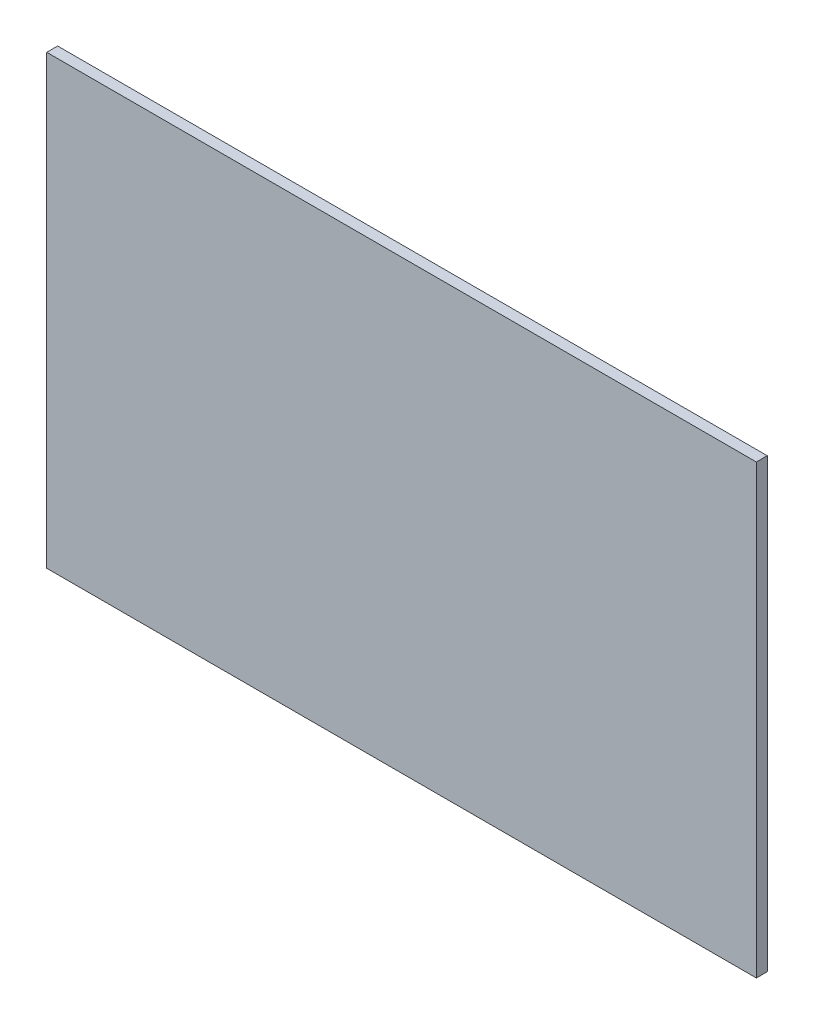
ISO-10303-21;
HEADER;
FILE_DESCRIPTION(('STEP AP214'),'2;1');
FILE_NAME('part.step','',(''),(''),'','','');
FILE_SCHEMA(('AUTOMOTIVE_DESIGN { 1 0 10303 214 1 1 1 1 }'));
ENDSEC;
DATA;
#1=APPLICATION_CONTEXT('core data for automotive mechanical design processes');
#2=APPLICATION_PROTOCOL_DEFINITION('international standard','automotive_design',2000,#1);
#3=PRODUCT_CONTEXT('',#1,'mechanical');
#4=PRODUCT('Part','Part','',(#3));
#5=PRODUCT_RELATED_PRODUCT_CATEGORY('part','',(#4));
#6=PRODUCT_DEFINITION_FORMATION('','',#4);
#7=PRODUCT_DEFINITION_CONTEXT('part definition',#1,'design');
#8=PRODUCT_DEFINITION('design','',#6,#7);
#9=PRODUCT_DEFINITION_SHAPE('','',#8);
#10=(LENGTH_UNIT() NAMED_UNIT(*) SI_UNIT(.MILLI.,.METRE.));
#11=(NAMED_UNIT(*) PLANE_ANGLE_UNIT() SI_UNIT($,.RADIAN.));
#12=(NAMED_UNIT(*) SI_UNIT($,.STERADIAN.) SOLID_ANGLE_UNIT());
#13=UNCERTAINTY_MEASURE_WITH_UNIT(LENGTH_MEASURE(1.E-05),#10,'distance_accuracy_value','');
#14=(GEOMETRIC_REPRESENTATION_CONTEXT(3) GLOBAL_UNCERTAINTY_ASSIGNED_CONTEXT((#13)) GLOBAL_UNIT_ASSIGNED_CONTEXT((#10,
#11,#12)) REPRESENTATION_CONTEXT('',''));
#15=CARTESIAN_POINT('',(0.,0.,0.));
#16=DIRECTION('',(0.,0.,1.));
#17=DIRECTION('',(1.,0.,0.));
#18=AXIS2_PLACEMENT_3D('',#15,#16,#17);
#19=CARTESIAN_POINT('',(0.,0.,3.5));
#20=DIRECTION('',(-1.,0.,0.));
#21=DIRECTION('',(0.,0.,1.));
#22=AXIS2_PLACEMENT_3D('',#19,#20,#21);
#23=PLANE('',#22);
#24=DIRECTION('',(0.,1.,0.));
#25=VECTOR('',#24,1.);
#26=CARTESIAN_POINT('',(0.,0.,0.));
#27=LINE('',#26,#25);
#28=CARTESIAN_POINT('',(0.,0.,0.));
#29=VERTEX_POINT('',#28);
#30=CARTESIAN_POINT('',(0.,143.572277227723,0.));
#31=VERTEX_POINT('',#30);
#32=EDGE_CURVE('E96',#29,#31,#27,.T.);
#33=ORIENTED_EDGE('',*,*,#32,.T.);
#34=DIRECTION('',(0.,0.,-1.));
#35=VECTOR('',#34,1.);
#36=CARTESIAN_POINT('',(0.,143.572277227723,3.5));
#37=LINE('',#36,#35);
#38=CARTESIAN_POINT('',(0.,143.572277227723,3.5));
#39=VERTEX_POINT('',#38);
#40=EDGE_CURVE('E11',#39,#31,#37,.T.);
#41=ORIENTED_EDGE('',*,*,#40,.F.);
#42=DIRECTION('',(0.,1.,0.));
#43=VECTOR('',#42,1.);
#44=CARTESIAN_POINT('',(0.,0.,3.5));
#45=LINE('',#44,#43);
#46=CARTESIAN_POINT('',(0.,0.,3.5));
#47=VERTEX_POINT('',#46);
#48=EDGE_CURVE('E84',#47,#39,#45,.T.);
#49=ORIENTED_EDGE('',*,*,#48,.F.);
#50=DIRECTION('',(0.,0.,-1.));
#51=VECTOR('',#50,1.);
#52=CARTESIAN_POINT('',(0.,0.,3.5));
#53=LINE('',#52,#51);
#54=EDGE_CURVE('E92',#47,#29,#53,.T.);
#55=ORIENTED_EDGE('',*,*,#54,.T.);
#56=EDGE_LOOP('',(#33,#41,#49,#55));
#57=FACE_BOUND('',#56,.T.);
#58=ADVANCED_FACE('F33',(#57),#23,.F.);
#59=CARTESIAN_POINT('',(0.,143.572277227723,3.5));
#60=DIRECTION('',(0.,-1.,0.));
#61=DIRECTION('',(0.,0.,-1.));
#62=AXIS2_PLACEMENT_3D('',#59,#60,#61);
#63=PLANE('',#62);
#64=DIRECTION('',(-1.,0.,0.));
#65=VECTOR('',#64,1.);
#66=CARTESIAN_POINT('',(0.,143.572277227723,0.));
#67=LINE('',#66,#65);
#68=CARTESIAN_POINT('',(-228.,143.572277227723,0.));
#69=VERTEX_POINT('',#68);
#70=EDGE_CURVE('E88',#31,#69,#67,.T.);
#71=ORIENTED_EDGE('',*,*,#70,.T.);
#72=DIRECTION('',(0.,0.,-1.));
#73=VECTOR('',#72,1.);
#74=CARTESIAN_POINT('',(-228.,143.572277227723,3.5));
#75=LINE('',#74,#73);
#76=CARTESIAN_POINT('',(-228.,143.572277227723,3.5));
#77=VERTEX_POINT('',#76);
#78=EDGE_CURVE('E41',#77,#69,#75,.T.);
#79=ORIENTED_EDGE('',*,*,#78,.F.);
#80=DIRECTION('',(-1.,0.,0.));
#81=VECTOR('',#80,1.);
#82=CARTESIAN_POINT('',(0.,143.572277227723,3.5));
#83=LINE('',#82,#81);
#84=EDGE_CURVE('E79',#39,#77,#83,.T.);
#85=ORIENTED_EDGE('',*,*,#84,.F.);
#86=ORIENTED_EDGE('',*,*,#40,.T.);
#87=EDGE_LOOP('',(#71,#79,#85,#86));
#88=FACE_BOUND('',#87,.T.);
#89=ADVANCED_FACE('F87',(#88),#63,.F.);
#90=CARTESIAN_POINT('',(-228.,0.,3.5));
#91=DIRECTION('',(1.,0.,0.));
#92=DIRECTION('',(0.,0.,-1.));
#93=AXIS2_PLACEMENT_3D('',#90,#91,#92);
#94=PLANE('',#93);
#95=DIRECTION('',(0.,-1.,0.));
#96=VECTOR('',#95,1.);
#97=CARTESIAN_POINT('',(-228.,0.,0.));
#98=LINE('',#97,#96);
#99=CARTESIAN_POINT('',(-228.,0.,0.));
#100=VERTEX_POINT('',#99);
#101=EDGE_CURVE('E66',#69,#100,#98,.T.);
#102=ORIENTED_EDGE('',*,*,#101,.T.);
#103=DIRECTION('',(0.,0.,-1.));
#104=VECTOR('',#103,1.);
#105=CARTESIAN_POINT('',(-228.,0.,3.5));
#106=LINE('',#105,#104);
#107=CARTESIAN_POINT('',(-228.,0.,3.5));
#108=VERTEX_POINT('',#107);
#109=EDGE_CURVE('E89',#108,#100,#106,.T.);
#110=ORIENTED_EDGE('',*,*,#109,.F.);
#111=DIRECTION('',(0.,-1.,0.));
#112=VECTOR('',#111,1.);
#113=CARTESIAN_POINT('',(-228.,0.,3.5));
#114=LINE('',#113,#112);
#115=EDGE_CURVE('E82',#77,#108,#114,.T.);
#116=ORIENTED_EDGE('',*,*,#115,.F.);
#117=ORIENTED_EDGE('',*,*,#78,.T.);
#118=EDGE_LOOP('',(#102,#110,#116,#117));
#119=FACE_BOUND('',#118,.T.);
#120=ADVANCED_FACE('F90',(#119),#94,.F.);
#121=CARTESIAN_POINT('',(0.,0.,3.5));
#122=DIRECTION('',(0.,1.,0.));
#123=DIRECTION('',(0.,0.,1.));
#124=AXIS2_PLACEMENT_3D('',#121,#122,#123);
#125=PLANE('',#124);
#126=DIRECTION('',(1.,0.,0.));
#127=VECTOR('',#126,1.);
#128=CARTESIAN_POINT('',(0.,0.,0.));
#129=LINE('',#128,#127);
#130=EDGE_CURVE('E72',#100,#29,#129,.T.);
#131=ORIENTED_EDGE('',*,*,#130,.T.);
#132=ORIENTED_EDGE('',*,*,#54,.F.);
#133=DIRECTION('',(1.,0.,0.));
#134=VECTOR('',#133,1.);
#135=CARTESIAN_POINT('',(0.,0.,3.5));
#136=LINE('',#135,#134);
#137=EDGE_CURVE('E49',#108,#47,#136,.T.);
#138=ORIENTED_EDGE('',*,*,#137,.F.);
#139=ORIENTED_EDGE('',*,*,#109,.T.);
#140=EDGE_LOOP('',(#131,#132,#138,#139));
#141=FACE_BOUND('',#140,.T.);
#142=ADVANCED_FACE('F103',(#141),#125,.F.);
#143=CARTESIAN_POINT('',(0.,0.,3.5));
#144=DIRECTION('',(0.,0.,1.));
#145=DIRECTION('',(1.,0.,0.));
#146=AXIS2_PLACEMENT_3D('',#143,#144,#145);
#147=PLANE('',#146);
#148=ORIENTED_EDGE('',*,*,#48,.T.);
#149=ORIENTED_EDGE('',*,*,#84,.T.);
#150=ORIENTED_EDGE('',*,*,#115,.T.);
#151=ORIENTED_EDGE('',*,*,#137,.T.);
#152=EDGE_LOOP('',(#148,#149,#150,#151));
#153=FACE_BOUND('',#152,.T.);
#154=ADVANCED_FACE('F80',(#153),#147,.T.);
#155=CARTESIAN_POINT('',(0.,0.,0.));
#156=DIRECTION('',(0.,0.,1.));
#157=DIRECTION('',(1.,0.,0.));
#158=AXIS2_PLACEMENT_3D('',#155,#156,#157);
#159=PLANE('',#158);
#160=ORIENTED_EDGE('',*,*,#32,.F.);
#161=ORIENTED_EDGE('',*,*,#130,.F.);
#162=ORIENTED_EDGE('',*,*,#101,.F.);
#163=ORIENTED_EDGE('',*,*,#70,.F.);
#164=EDGE_LOOP('',(#160,#161,#162,#163));
#165=FACE_BOUND('',#164,.T.);
#166=ADVANCED_FACE('F106',(#165),#159,.F.);
#167=CLOSED_SHELL('',(#58,#89,#120,#142,#154,#166));
#168=MANIFOLD_SOLID_BREP('B2',#167);
#169=ADVANCED_BREP_SHAPE_REPRESENTATION('',(#18,#168),#14);
#170=SHAPE_DEFINITION_REPRESENTATION(#9,#169);
ENDSEC;
END-ISO-10303-21;
